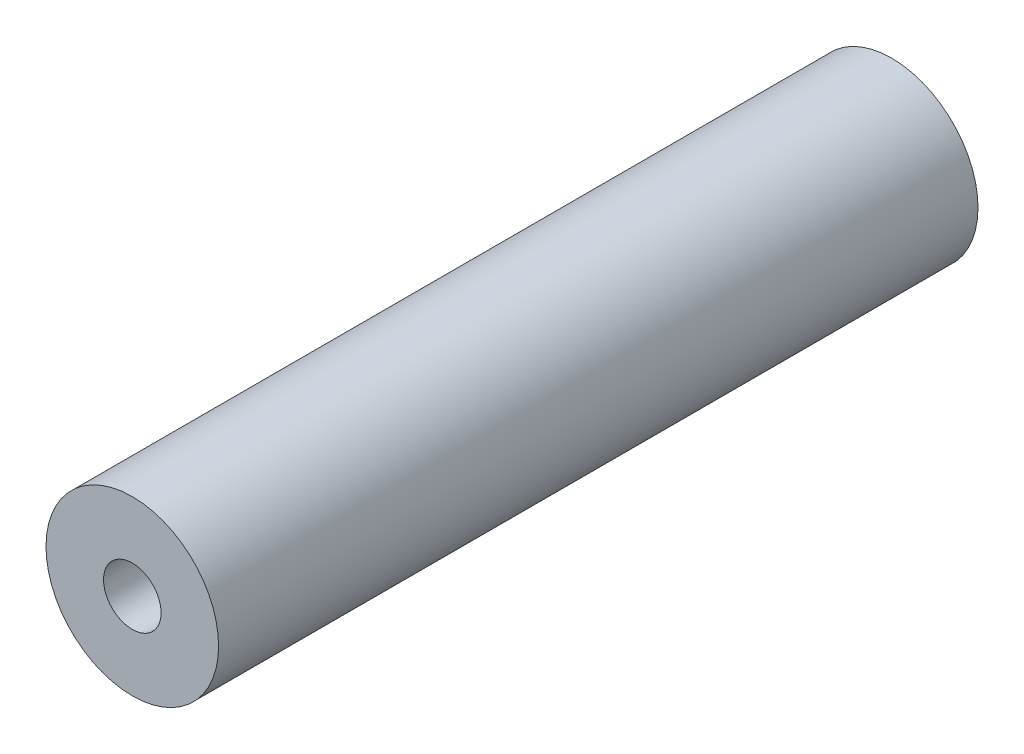
ISO-10303-21;
HEADER;
FILE_DESCRIPTION(('STEP AP214'),'2;1');
FILE_NAME('part.step','',(''),(''),'','','');
FILE_SCHEMA(('AUTOMOTIVE_DESIGN { 1 0 10303 214 1 1 1 1 }'));
ENDSEC;
DATA;
#1=APPLICATION_CONTEXT('core data for automotive mechanical design processes');
#2=APPLICATION_PROTOCOL_DEFINITION('international standard','automotive_design',2000,#1);
#3=PRODUCT_CONTEXT('',#1,'mechanical');
#4=PRODUCT('Part','Part','',(#3));
#5=PRODUCT_RELATED_PRODUCT_CATEGORY('part','',(#4));
#6=PRODUCT_DEFINITION_FORMATION('','',#4);
#7=PRODUCT_DEFINITION_CONTEXT('part definition',#1,'design');
#8=PRODUCT_DEFINITION('design','',#6,#7);
#9=PRODUCT_DEFINITION_SHAPE('','',#8);
#10=(LENGTH_UNIT() NAMED_UNIT(*) SI_UNIT(.MILLI.,.METRE.));
#11=(NAMED_UNIT(*) PLANE_ANGLE_UNIT() SI_UNIT($,.RADIAN.));
#12=(NAMED_UNIT(*) SI_UNIT($,.STERADIAN.) SOLID_ANGLE_UNIT());
#13=UNCERTAINTY_MEASURE_WITH_UNIT(LENGTH_MEASURE(1.E-05),#10,'distance_accuracy_value','');
#14=(GEOMETRIC_REPRESENTATION_CONTEXT(3) GLOBAL_UNCERTAINTY_ASSIGNED_CONTEXT((#13)) GLOBAL_UNIT_ASSIGNED_CONTEXT((#10,
#11,#12)) REPRESENTATION_CONTEXT('',''));
#15=CARTESIAN_POINT('',(0.,0.,0.));
#16=DIRECTION('',(0.,0.,1.));
#17=DIRECTION('',(1.,0.,0.));
#18=AXIS2_PLACEMENT_3D('',#15,#16,#17);
#19=CARTESIAN_POINT('',(0.,0.,33.));
#20=DIRECTION('',(0.,0.,-1.));
#21=DIRECTION('',(-1.,0.,0.));
#22=AXIS2_PLACEMENT_3D('',#19,#20,#21);
#23=CYLINDRICAL_SURFACE('',#22,7.5);
#24=CARTESIAN_POINT('',(0.,0.,33.));
#25=DIRECTION('',(0.,0.,1.));
#26=DIRECTION('',(1.,0.,0.));
#27=AXIS2_PLACEMENT_3D('',#24,#25,#26);
#28=CIRCLE('',#27,7.5);
#29=CARTESIAN_POINT('',(7.5,0.,33.));
#30=VERTEX_POINT('',#29);
#31=EDGE_CURVE('E11',#30,#30,#28,.T.);
#32=ORIENTED_EDGE('',*,*,#31,.F.);
#33=EDGE_LOOP('',(#32));
#34=FACE_BOUND('',#33,.T.);
#35=CARTESIAN_POINT('',(0.,0.,-33.));
#36=DIRECTION('',(0.,0.,1.));
#37=DIRECTION('',(1.,0.,0.));
#38=AXIS2_PLACEMENT_3D('',#35,#36,#37);
#39=CIRCLE('',#38,7.5);
#40=CARTESIAN_POINT('',(7.5,0.,-33.));
#41=VERTEX_POINT('',#40);
#42=EDGE_CURVE('E52',#41,#41,#39,.T.);
#43=ORIENTED_EDGE('',*,*,#42,.T.);
#44=EDGE_LOOP('',(#43));
#45=FACE_BOUND('',#44,.T.);
#46=ADVANCED_FACE('F49',(#34,#45),#23,.T.);
#47=CARTESIAN_POINT('',(0.,0.,33.));
#48=DIRECTION('',(0.,0.,1.));
#49=DIRECTION('',(1.,0.,0.));
#50=AXIS2_PLACEMENT_3D('',#47,#48,#49);
#51=PLANE('',#50);
#52=CARTESIAN_POINT('',(0.,0.,33.));
#53=DIRECTION('',(0.,0.,1.));
#54=DIRECTION('',(1.,0.,0.));
#55=AXIS2_PLACEMENT_3D('',#52,#53,#54);
#56=CIRCLE('',#55,2.5);
#57=CARTESIAN_POINT('',(2.5,0.,33.));
#58=VERTEX_POINT('',#57);
#59=EDGE_CURVE('E74',#58,#58,#56,.T.);
#60=ORIENTED_EDGE('',*,*,#59,.F.);
#61=EDGE_LOOP('',(#60));
#62=FACE_BOUND('',#61,.T.);
#63=ORIENTED_EDGE('',*,*,#31,.T.);
#64=EDGE_LOOP('',(#63));
#65=FACE_BOUND('',#64,.T.);
#66=ADVANCED_FACE('F97',(#62,#65),#51,.T.);
#67=CARTESIAN_POINT('',(0.,0.,-33.));
#68=DIRECTION('',(0.,0.,1.));
#69=DIRECTION('',(1.,0.,0.));
#70=AXIS2_PLACEMENT_3D('',#67,#68,#69);
#71=PLANE('',#70);
#72=CARTESIAN_POINT('',(0.,0.,-33.));
#73=DIRECTION('',(0.,0.,-1.));
#74=DIRECTION('',(-1.,0.,0.));
#75=AXIS2_PLACEMENT_3D('',#72,#73,#74);
#76=CIRCLE('',#75,2.49999999999999);
#77=CARTESIAN_POINT('',(-2.49999999999999,0.,-33.));
#78=VERTEX_POINT('',#77);
#79=EDGE_CURVE('E75',#78,#78,#76,.T.);
#80=ORIENTED_EDGE('',*,*,#79,.F.);
#81=EDGE_LOOP('',(#80));
#82=FACE_BOUND('',#81,.T.);
#83=ORIENTED_EDGE('',*,*,#42,.F.);
#84=EDGE_LOOP('',(#83));
#85=FACE_BOUND('',#84,.T.);
#86=ADVANCED_FACE('F94',(#82,#85),#71,.F.);
#87=CARTESIAN_POINT('',(0.,0.,17.));
#88=DIRECTION('',(0.,0.,1.));
#89=DIRECTION('',(1.,0.,0.));
#90=AXIS2_PLACEMENT_3D('',#87,#88,#89);
#91=CONICAL_SURFACE('',#90,2.5,1.02974425867665);
#92=CARTESIAN_POINT('',(0.,0.,15.4978484524311));
#93=VERTEX_POINT('',#92);
#94=VERTEX_LOOP('',#93);
#95=FACE_BOUND('',#94,.T.);
#96=CARTESIAN_POINT('',(0.,0.,17.));
#97=DIRECTION('',(0.,0.,1.));
#98=DIRECTION('',(1.,0.,0.));
#99=AXIS2_PLACEMENT_3D('',#96,#97,#98);
#100=CIRCLE('',#99,2.5);
#101=CARTESIAN_POINT('',(2.5,0.,17.));
#102=VERTEX_POINT('',#101);
#103=EDGE_CURVE('E80',#102,#102,#100,.T.);
#104=ORIENTED_EDGE('',*,*,#103,.T.);
#105=EDGE_LOOP('',(#104));
#106=FACE_BOUND('',#105,.T.);
#107=ADVANCED_FACE('F96',(#95,#106),#91,.F.);
#108=CARTESIAN_POINT('',(0.,0.,33.));
#109=DIRECTION('',(0.,0.,1.));
#110=DIRECTION('',(1.,0.,0.));
#111=AXIS2_PLACEMENT_3D('',#108,#109,#110);
#112=CYLINDRICAL_SURFACE('',#111,2.5);
#113=ORIENTED_EDGE('',*,*,#103,.F.);
#114=EDGE_LOOP('',(#113));
#115=FACE_BOUND('',#114,.T.);
#116=ORIENTED_EDGE('',*,*,#59,.T.);
#117=EDGE_LOOP('',(#116));
#118=FACE_BOUND('',#117,.T.);
#119=ADVANCED_FACE('F67',(#115,#118),#112,.F.);
#120=CARTESIAN_POINT('',(0.,0.,-17.));
#121=DIRECTION('',(0.,0.,-1.));
#122=DIRECTION('',(-1.,0.,0.));
#123=AXIS2_PLACEMENT_3D('',#120,#121,#122);
#124=CONICAL_SURFACE('',#123,2.49999999999999,1.02974425867665);
#125=CARTESIAN_POINT('',(0.,0.,-15.4978484524311));
#126=VERTEX_POINT('',#125);
#127=VERTEX_LOOP('',#126);
#128=FACE_BOUND('',#127,.T.);
#129=CARTESIAN_POINT('',(0.,0.,-17.));
#130=DIRECTION('',(0.,0.,-1.));
#131=DIRECTION('',(-1.,0.,0.));
#132=AXIS2_PLACEMENT_3D('',#129,#130,#131);
#133=CIRCLE('',#132,2.49999999999999);
#134=CARTESIAN_POINT('',(-2.49999999999999,0.,-17.));
#135=VERTEX_POINT('',#134);
#136=EDGE_CURVE('E71',#135,#135,#133,.T.);
#137=ORIENTED_EDGE('',*,*,#136,.T.);
#138=EDGE_LOOP('',(#137));
#139=FACE_BOUND('',#138,.T.);
#140=ADVANCED_FACE('F63',(#128,#139),#124,.F.);
#141=CARTESIAN_POINT('',(0.,0.,-33.));
#142=DIRECTION('',(0.,0.,-1.));
#143=DIRECTION('',(-1.,0.,0.));
#144=AXIS2_PLACEMENT_3D('',#141,#142,#143);
#145=CYLINDRICAL_SURFACE('',#144,2.49999999999999);
#146=ORIENTED_EDGE('',*,*,#136,.F.);
#147=EDGE_LOOP('',(#146));
#148=FACE_BOUND('',#147,.T.);
#149=ORIENTED_EDGE('',*,*,#79,.T.);
#150=EDGE_LOOP('',(#149));
#151=FACE_BOUND('',#150,.T.);
#152=ADVANCED_FACE('F66',(#148,#151),#145,.F.);
#153=CLOSED_SHELL('',(#46,#66,#86,#107,#119,#140,#152));
#154=MANIFOLD_SOLID_BREP('B2',#153);
#155=ADVANCED_BREP_SHAPE_REPRESENTATION('',(#18,#154),#14);
#156=SHAPE_DEFINITION_REPRESENTATION(#9,#155);
ENDSEC;
END-ISO-10303-21;
